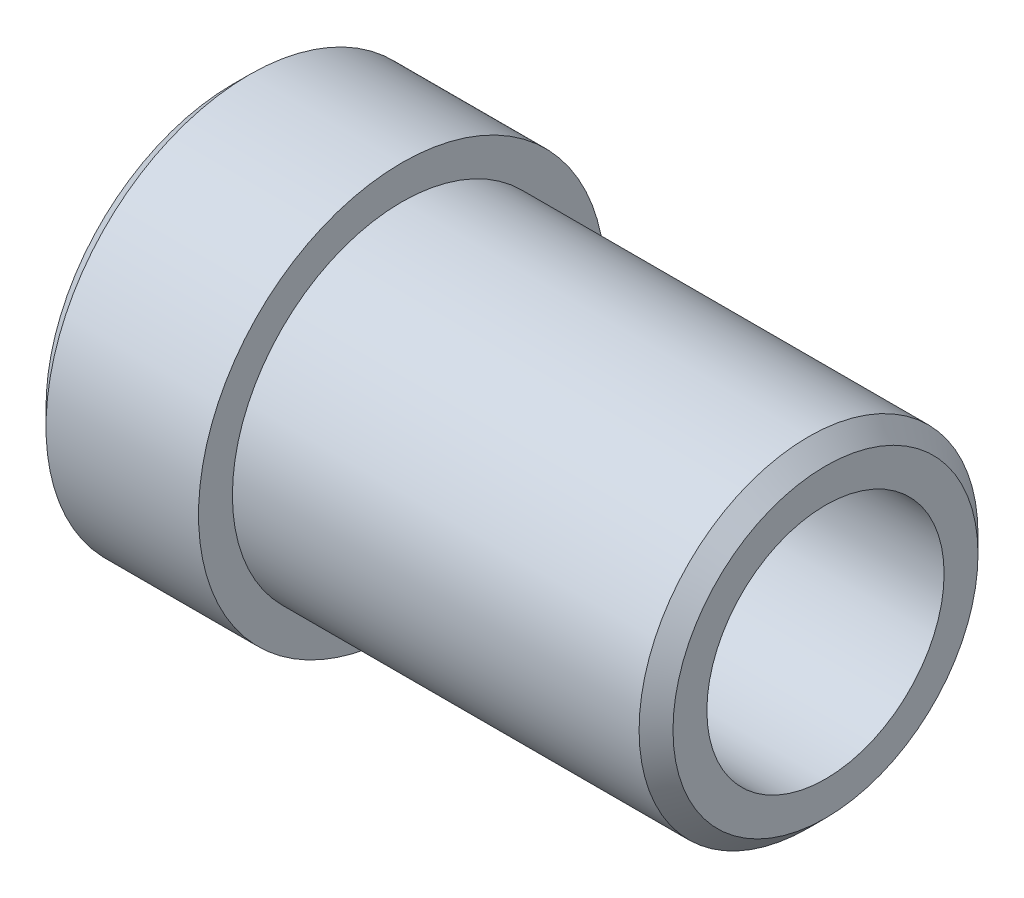
ISO-10303-21;
HEADER;
FILE_DESCRIPTION(('STEP AP214'),'2;1');
FILE_NAME('part.step','',(''),(''),'','','');
FILE_SCHEMA(('AUTOMOTIVE_DESIGN { 1 0 10303 214 1 1 1 1 }'));
ENDSEC;
DATA;
#1=APPLICATION_CONTEXT('core data for automotive mechanical design processes');
#2=APPLICATION_PROTOCOL_DEFINITION('international standard','automotive_design',2000,#1);
#3=PRODUCT_CONTEXT('',#1,'mechanical');
#4=PRODUCT('Part','Part','',(#3));
#5=PRODUCT_RELATED_PRODUCT_CATEGORY('part','',(#4));
#6=PRODUCT_DEFINITION_FORMATION('','',#4);
#7=PRODUCT_DEFINITION_CONTEXT('part definition',#1,'design');
#8=PRODUCT_DEFINITION('design','',#6,#7);
#9=PRODUCT_DEFINITION_SHAPE('','',#8);
#10=(LENGTH_UNIT() NAMED_UNIT(*) SI_UNIT(.MILLI.,.METRE.));
#11=(NAMED_UNIT(*) PLANE_ANGLE_UNIT() SI_UNIT($,.RADIAN.));
#12=(NAMED_UNIT(*) SI_UNIT($,.STERADIAN.) SOLID_ANGLE_UNIT());
#13=UNCERTAINTY_MEASURE_WITH_UNIT(LENGTH_MEASURE(1.E-05),#10,'distance_accuracy_value','');
#14=(GEOMETRIC_REPRESENTATION_CONTEXT(3) GLOBAL_UNCERTAINTY_ASSIGNED_CONTEXT((#13)) GLOBAL_UNIT_ASSIGNED_CONTEXT((#10,
#11,#12)) REPRESENTATION_CONTEXT('',''));
#15=CARTESIAN_POINT('',(0.,0.,0.));
#16=DIRECTION('',(0.,0.,1.));
#17=DIRECTION('',(1.,0.,0.));
#18=AXIS2_PLACEMENT_3D('',#15,#16,#17);
#19=CARTESIAN_POINT('',(0.,0.,0.));
#20=DIRECTION('',(-1.,0.,0.));
#21=DIRECTION('',(0.,-1.,0.));
#22=AXIS2_PLACEMENT_3D('',#19,#20,#21);
#23=PLANE('',#22);
#24=CARTESIAN_POINT('',(0.,0.,0.));
#25=DIRECTION('',(-1.,0.,0.));
#26=DIRECTION('',(0.,-1.,0.));
#27=AXIS2_PLACEMENT_3D('',#24,#25,#26);
#28=CIRCLE('',#27,8.99999999999999);
#29=CARTESIAN_POINT('',(0.,-8.99999999999999,0.));
#30=VERTEX_POINT('',#29);
#31=EDGE_CURVE('E48',#30,#30,#28,.F.);
#32=ORIENTED_EDGE('',*,*,#31,.T.);
#33=EDGE_LOOP('',(#32));
#34=FACE_BOUND('',#33,.T.);
#35=CARTESIAN_POINT('',(0.,0.,0.));
#36=DIRECTION('',(1.,0.,0.));
#37=DIRECTION('',(0.,1.,0.));
#38=AXIS2_PLACEMENT_3D('',#35,#36,#37);
#39=CIRCLE('',#38,7.);
#40=CARTESIAN_POINT('',(0.,7.,0.));
#41=VERTEX_POINT('',#40);
#42=EDGE_CURVE('E73',#41,#41,#39,.T.);
#43=ORIENTED_EDGE('',*,*,#42,.F.);
#44=EDGE_LOOP('',(#43));
#45=FACE_BOUND('',#44,.T.);
#46=ADVANCED_FACE('F39',(#34,#45),#23,.F.);
#47=CARTESIAN_POINT('',(0.,0.,0.));
#48=DIRECTION('',(1.,0.,0.));
#49=DIRECTION('',(0.,1.,0.));
#50=AXIS2_PLACEMENT_3D('',#47,#48,#49);
#51=CYLINDRICAL_SURFACE('',#50,10.);
#52=CARTESIAN_POINT('',(-1.00000000000001,0.,0.));
#53=DIRECTION('',(-1.,0.,0.));
#54=DIRECTION('',(0.,-1.,0.));
#55=AXIS2_PLACEMENT_3D('',#52,#53,#54);
#56=CIRCLE('',#55,10.);
#57=CARTESIAN_POINT('',(-1.00000000000001,-10.,0.));
#58=VERTEX_POINT('',#57);
#59=EDGE_CURVE('E10',#58,#58,#56,.T.);
#60=ORIENTED_EDGE('',*,*,#59,.T.);
#61=EDGE_LOOP('',(#60));
#62=FACE_BOUND('',#61,.T.);
#63=CARTESIAN_POINT('',(-25.,0.,0.));
#64=DIRECTION('',(1.,0.,0.));
#65=DIRECTION('',(0.,1.,0.));
#66=AXIS2_PLACEMENT_3D('',#63,#64,#65);
#67=CIRCLE('',#66,10.);
#68=CARTESIAN_POINT('',(-25.,10.,0.));
#69=VERTEX_POINT('',#68);
#70=EDGE_CURVE('E64',#69,#69,#67,.T.);
#71=ORIENTED_EDGE('',*,*,#70,.T.);
#72=EDGE_LOOP('',(#71));
#73=FACE_BOUND('',#72,.T.);
#74=ADVANCED_FACE('F91',(#62,#73),#51,.T.);
#75=CARTESIAN_POINT('',(-25.,-10.,0.));
#76=DIRECTION('',(-1.,0.,0.));
#77=DIRECTION('',(0.,-1.,0.));
#78=AXIS2_PLACEMENT_3D('',#75,#76,#77);
#79=PLANE('',#78);
#80=ORIENTED_EDGE('',*,*,#70,.F.);
#81=EDGE_LOOP('',(#80));
#82=FACE_BOUND('',#81,.T.);
#83=CARTESIAN_POINT('',(-25.,0.,0.));
#84=DIRECTION('',(1.,0.,0.));
#85=DIRECTION('',(0.,1.,0.));
#86=AXIS2_PLACEMENT_3D('',#83,#84,#85);
#87=CIRCLE('',#86,12.);
#88=CARTESIAN_POINT('',(-25.,12.,0.));
#89=VERTEX_POINT('',#88);
#90=EDGE_CURVE('E68',#89,#89,#87,.T.);
#91=ORIENTED_EDGE('',*,*,#90,.T.);
#92=EDGE_LOOP('',(#91));
#93=FACE_BOUND('',#92,.T.);
#94=ADVANCED_FACE('F96',(#82,#93),#79,.F.);
#95=CARTESIAN_POINT('',(0.,0.,0.));
#96=DIRECTION('',(1.,0.,0.));
#97=DIRECTION('',(0.,1.,0.));
#98=AXIS2_PLACEMENT_3D('',#95,#96,#97);
#99=CYLINDRICAL_SURFACE('',#98,12.);
#100=CARTESIAN_POINT('',(-34.,0.,0.));
#101=DIRECTION('',(1.,0.,0.));
#102=DIRECTION('',(0.,1.,0.));
#103=AXIS2_PLACEMENT_3D('',#100,#101,#102);
#104=CIRCLE('',#103,12.);
#105=CARTESIAN_POINT('',(-34.,12.,0.));
#106=VERTEX_POINT('',#105);
#107=EDGE_CURVE('E58',#106,#106,#104,.T.);
#108=ORIENTED_EDGE('',*,*,#107,.T.);
#109=EDGE_LOOP('',(#108));
#110=FACE_BOUND('',#109,.T.);
#111=ORIENTED_EDGE('',*,*,#90,.F.);
#112=EDGE_LOOP('',(#111));
#113=FACE_BOUND('',#112,.T.);
#114=ADVANCED_FACE('F112',(#110,#113),#99,.T.);
#115=CARTESIAN_POINT('',(-35.,-12.,0.));
#116=DIRECTION('',(1.,0.,0.));
#117=DIRECTION('',(0.,1.,0.));
#118=AXIS2_PLACEMENT_3D('',#115,#116,#117);
#119=PLANE('',#118);
#120=CARTESIAN_POINT('',(-35.,0.,0.));
#121=DIRECTION('',(1.,0.,0.));
#122=DIRECTION('',(0.,1.,0.));
#123=AXIS2_PLACEMENT_3D('',#120,#121,#122);
#124=CIRCLE('',#123,11.);
#125=CARTESIAN_POINT('',(-35.,11.,0.));
#126=VERTEX_POINT('',#125);
#127=EDGE_CURVE('E53',#126,#126,#124,.F.);
#128=ORIENTED_EDGE('',*,*,#127,.T.);
#129=EDGE_LOOP('',(#128));
#130=FACE_BOUND('',#129,.T.);
#131=CARTESIAN_POINT('',(-35.,0.,0.));
#132=DIRECTION('',(1.,0.,0.));
#133=DIRECTION('',(0.,1.,0.));
#134=AXIS2_PLACEMENT_3D('',#131,#132,#133);
#135=CIRCLE('',#134,7.);
#136=CARTESIAN_POINT('',(-35.,7.,0.));
#137=VERTEX_POINT('',#136);
#138=EDGE_CURVE('E72',#137,#137,#135,.T.);
#139=ORIENTED_EDGE('',*,*,#138,.T.);
#140=EDGE_LOOP('',(#139));
#141=FACE_BOUND('',#140,.T.);
#142=ADVANCED_FACE('F81',(#130,#141),#119,.F.);
#143=CARTESIAN_POINT('',(-35.,0.,0.));
#144=DIRECTION('',(1.,0.,0.));
#145=DIRECTION('',(0.,1.,0.));
#146=AXIS2_PLACEMENT_3D('',#143,#144,#145);
#147=CYLINDRICAL_SURFACE('',#146,7.);
#148=ORIENTED_EDGE('',*,*,#138,.F.);
#149=EDGE_LOOP('',(#148));
#150=FACE_BOUND('',#149,.T.);
#151=ORIENTED_EDGE('',*,*,#42,.T.);
#152=EDGE_LOOP('',(#151));
#153=FACE_BOUND('',#152,.T.);
#154=ADVANCED_FACE('F83',(#150,#153),#147,.F.);
#155=CARTESIAN_POINT('',(-34.,0.,0.));
#156=DIRECTION('',(1.,0.,0.));
#157=DIRECTION('',(0.,1.,0.));
#158=AXIS2_PLACEMENT_3D('',#155,#156,#157);
#159=CONICAL_SURFACE('',#158,12.,0.785398163397452);
#160=ORIENTED_EDGE('',*,*,#127,.F.);
#161=EDGE_LOOP('',(#160));
#162=FACE_BOUND('',#161,.T.);
#163=ORIENTED_EDGE('',*,*,#107,.F.);
#164=EDGE_LOOP('',(#163));
#165=FACE_BOUND('',#164,.T.);
#166=ADVANCED_FACE('F86',(#162,#165),#159,.T.);
#167=CARTESIAN_POINT('',(0.,0.,0.));
#168=DIRECTION('',(-1.,0.,0.));
#169=DIRECTION('',(0.,-1.,0.));
#170=AXIS2_PLACEMENT_3D('',#167,#168,#169);
#171=CONICAL_SURFACE('',#170,8.99999999999999,0.785398163397448);
#172=ORIENTED_EDGE('',*,*,#59,.F.);
#173=EDGE_LOOP('',(#172));
#174=FACE_BOUND('',#173,.T.);
#175=ORIENTED_EDGE('',*,*,#31,.F.);
#176=EDGE_LOOP('',(#175));
#177=FACE_BOUND('',#176,.T.);
#178=ADVANCED_FACE('F42',(#174,#177),#171,.T.);
#179=CLOSED_SHELL('',(#46,#74,#94,#114,#142,#154,#166,#178));
#180=MANIFOLD_SOLID_BREP('B2',#179);
#181=ADVANCED_BREP_SHAPE_REPRESENTATION('',(#18,#180),#14);
#182=SHAPE_DEFINITION_REPRESENTATION(#9,#181);
ENDSEC;
END-ISO-10303-21;
